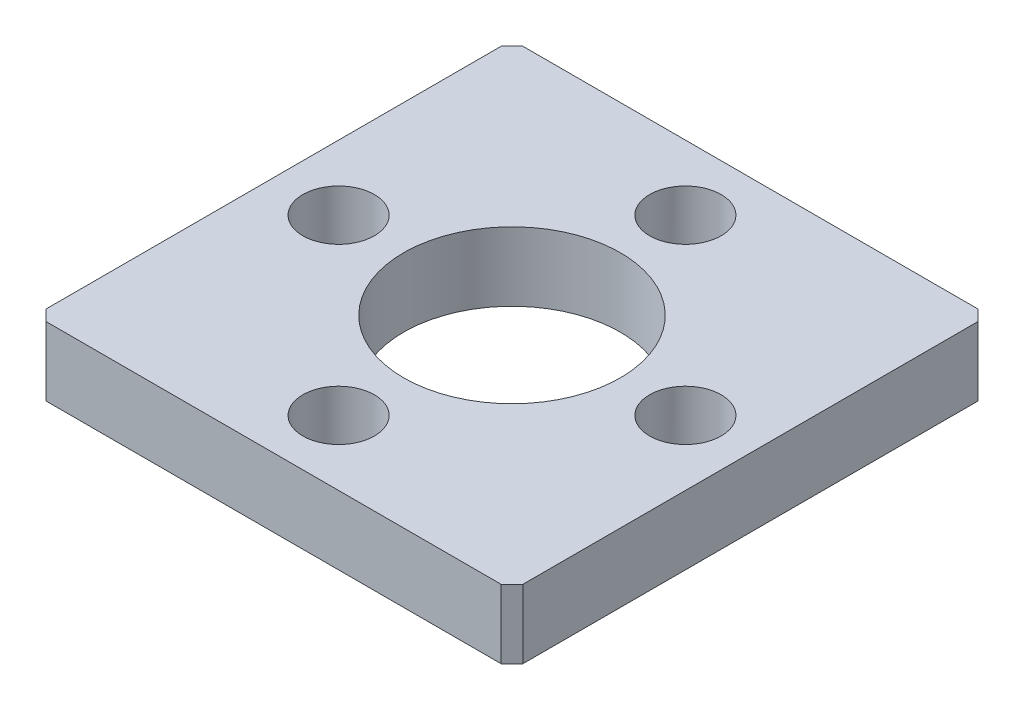
ISO-10303-21;
HEADER;
FILE_DESCRIPTION(('STEP AP214'),'2;1');
FILE_NAME('part.step','',(''),(''),'','','');
FILE_SCHEMA(('AUTOMOTIVE_DESIGN { 1 0 10303 214 1 1 1 1 }'));
ENDSEC;
DATA;
#1=APPLICATION_CONTEXT('core data for automotive mechanical design processes');
#2=APPLICATION_PROTOCOL_DEFINITION('international standard','automotive_design',2000,#1);
#3=PRODUCT_CONTEXT('',#1,'mechanical');
#4=PRODUCT('Part','Part','',(#3));
#5=PRODUCT_RELATED_PRODUCT_CATEGORY('part','',(#4));
#6=PRODUCT_DEFINITION_FORMATION('','',#4);
#7=PRODUCT_DEFINITION_CONTEXT('part definition',#1,'design');
#8=PRODUCT_DEFINITION('design','',#6,#7);
#9=PRODUCT_DEFINITION_SHAPE('','',#8);
#10=(LENGTH_UNIT() NAMED_UNIT(*) SI_UNIT(.MILLI.,.METRE.));
#11=(NAMED_UNIT(*) PLANE_ANGLE_UNIT() SI_UNIT($,.RADIAN.));
#12=(NAMED_UNIT(*) SI_UNIT($,.STERADIAN.) SOLID_ANGLE_UNIT());
#13=UNCERTAINTY_MEASURE_WITH_UNIT(LENGTH_MEASURE(1.E-05),#10,'distance_accuracy_value','');
#14=(GEOMETRIC_REPRESENTATION_CONTEXT(3) GLOBAL_UNCERTAINTY_ASSIGNED_CONTEXT((#13)) GLOBAL_UNIT_ASSIGNED_CONTEXT((#10,
#11,#12)) REPRESENTATION_CONTEXT('',''));
#15=CARTESIAN_POINT('',(0.,0.,0.));
#16=DIRECTION('',(0.,0.,1.));
#17=DIRECTION('',(1.,0.,0.));
#18=AXIS2_PLACEMENT_3D('',#15,#16,#17);
#19=CARTESIAN_POINT('',(11.,3.175,11.));
#20=DIRECTION('',(-1.,0.,0.));
#21=DIRECTION('',(0.,0.,1.));
#22=AXIS2_PLACEMENT_3D('',#19,#20,#21);
#23=PLANE('',#22);
#24=DIRECTION('',(0.,0.,-1.));
#25=VECTOR('',#24,1.);
#26=CARTESIAN_POINT('',(11.,0.,11.));
#27=LINE('',#26,#25);
#28=CARTESIAN_POINT('',(11.,0.,10.5));
#29=VERTEX_POINT('',#28);
#30=CARTESIAN_POINT('',(11.,0.,-10.5));
#31=VERTEX_POINT('',#30);
#32=EDGE_CURVE('E137',#29,#31,#27,.T.);
#33=ORIENTED_EDGE('',*,*,#32,.T.);
#34=DIRECTION('',(0.,1.,0.));
#35=VECTOR('',#34,1.);
#36=CARTESIAN_POINT('',(11.,3.175,-10.5));
#37=LINE('',#36,#35);
#38=CARTESIAN_POINT('',(11.,3.175,-10.5));
#39=VERTEX_POINT('',#38);
#40=EDGE_CURVE('E160',#31,#39,#37,.T.);
#41=ORIENTED_EDGE('',*,*,#40,.T.);
#42=DIRECTION('',(0.,0.,-1.));
#43=VECTOR('',#42,1.);
#44=CARTESIAN_POINT('',(11.,3.175,11.));
#45=LINE('',#44,#43);
#46=CARTESIAN_POINT('',(11.,3.175,10.5));
#47=VERTEX_POINT('',#46);
#48=EDGE_CURVE('E135',#47,#39,#45,.T.);
#49=ORIENTED_EDGE('',*,*,#48,.F.);
#50=DIRECTION('',(0.,-1.,0.));
#51=VECTOR('',#50,1.);
#52=CARTESIAN_POINT('',(11.,3.175,10.5));
#53=LINE('',#52,#51);
#54=EDGE_CURVE('E157',#47,#29,#53,.T.);
#55=ORIENTED_EDGE('',*,*,#54,.T.);
#56=EDGE_LOOP('',(#33,#41,#49,#55));
#57=FACE_BOUND('',#56,.T.);
#58=ADVANCED_FACE('F39',(#57),#23,.F.);
#59=CARTESIAN_POINT('',(-11.,3.175,-11.));
#60=DIRECTION('',(0.,0.,1.));
#61=DIRECTION('',(1.,0.,0.));
#62=AXIS2_PLACEMENT_3D('',#59,#60,#61);
#63=PLANE('',#62);
#64=DIRECTION('',(-1.,0.,0.));
#65=VECTOR('',#64,1.);
#66=CARTESIAN_POINT('',(-11.,0.,-11.));
#67=LINE('',#66,#65);
#68=CARTESIAN_POINT('',(10.5,0.,-11.));
#69=VERTEX_POINT('',#68);
#70=CARTESIAN_POINT('',(-10.5,0.,-11.));
#71=VERTEX_POINT('',#70);
#72=EDGE_CURVE('E133',#69,#71,#67,.T.);
#73=ORIENTED_EDGE('',*,*,#72,.T.);
#74=DIRECTION('',(0.,1.,0.));
#75=VECTOR('',#74,1.);
#76=CARTESIAN_POINT('',(-10.5,3.175,-11.));
#77=LINE('',#76,#75);
#78=CARTESIAN_POINT('',(-10.5,3.175,-11.));
#79=VERTEX_POINT('',#78);
#80=EDGE_CURVE('E112',#71,#79,#77,.T.);
#81=ORIENTED_EDGE('',*,*,#80,.T.);
#82=DIRECTION('',(-1.,0.,0.));
#83=VECTOR('',#82,1.);
#84=CARTESIAN_POINT('',(-11.,3.175,-11.));
#85=LINE('',#84,#83);
#86=CARTESIAN_POINT('',(10.5,3.175,-11.));
#87=VERTEX_POINT('',#86);
#88=EDGE_CURVE('E192',#87,#79,#85,.T.);
#89=ORIENTED_EDGE('',*,*,#88,.F.);
#90=DIRECTION('',(0.,-1.,0.));
#91=VECTOR('',#90,1.);
#92=CARTESIAN_POINT('',(10.5,3.175,-11.));
#93=LINE('',#92,#91);
#94=EDGE_CURVE('E117',#87,#69,#93,.T.);
#95=ORIENTED_EDGE('',*,*,#94,.T.);
#96=EDGE_LOOP('',(#73,#81,#89,#95));
#97=FACE_BOUND('',#96,.T.);
#98=ADVANCED_FACE('F209',(#97),#63,.F.);
#99=CARTESIAN_POINT('',(-11.,3.175,11.));
#100=DIRECTION('',(1.,0.,0.));
#101=DIRECTION('',(0.,0.,-1.));
#102=AXIS2_PLACEMENT_3D('',#99,#100,#101);
#103=PLANE('',#102);
#104=DIRECTION('',(0.,0.,1.));
#105=VECTOR('',#104,1.);
#106=CARTESIAN_POINT('',(-11.,3.175,11.));
#107=LINE('',#106,#105);
#108=CARTESIAN_POINT('',(-11.,3.175,-10.5));
#109=VERTEX_POINT('',#108);
#110=CARTESIAN_POINT('',(-11.,3.175,10.5));
#111=VERTEX_POINT('',#110);
#112=EDGE_CURVE('E126',#109,#111,#107,.T.);
#113=ORIENTED_EDGE('',*,*,#112,.F.);
#114=DIRECTION('',(0.,-1.,0.));
#115=VECTOR('',#114,1.);
#116=CARTESIAN_POINT('',(-11.,3.175,-10.5));
#117=LINE('',#116,#115);
#118=CARTESIAN_POINT('',(-11.,0.,-10.5));
#119=VERTEX_POINT('',#118);
#120=EDGE_CURVE('E111',#109,#119,#117,.T.);
#121=ORIENTED_EDGE('',*,*,#120,.T.);
#122=DIRECTION('',(0.,0.,1.));
#123=VECTOR('',#122,1.);
#124=CARTESIAN_POINT('',(-11.,0.,11.));
#125=LINE('',#124,#123);
#126=CARTESIAN_POINT('',(-11.,0.,10.5));
#127=VERTEX_POINT('',#126);
#128=EDGE_CURVE('E124',#119,#127,#125,.T.);
#129=ORIENTED_EDGE('',*,*,#128,.T.);
#130=DIRECTION('',(0.,1.,0.));
#131=VECTOR('',#130,1.);
#132=CARTESIAN_POINT('',(-11.,3.175,10.5));
#133=LINE('',#132,#131);
#134=EDGE_CURVE('E128',#127,#111,#133,.T.);
#135=ORIENTED_EDGE('',*,*,#134,.T.);
#136=EDGE_LOOP('',(#113,#121,#129,#135));
#137=FACE_BOUND('',#136,.T.);
#138=ADVANCED_FACE('F123',(#137),#103,.F.);
#139=CARTESIAN_POINT('',(-11.,3.175,11.));
#140=DIRECTION('',(0.,0.,-1.));
#141=DIRECTION('',(-1.,0.,0.));
#142=AXIS2_PLACEMENT_3D('',#139,#140,#141);
#143=PLANE('',#142);
#144=DIRECTION('',(1.,0.,0.));
#145=VECTOR('',#144,1.);
#146=CARTESIAN_POINT('',(-11.,0.,11.));
#147=LINE('',#146,#145);
#148=CARTESIAN_POINT('',(-10.5,0.,11.));
#149=VERTEX_POINT('',#148);
#150=CARTESIAN_POINT('',(10.5,0.,11.));
#151=VERTEX_POINT('',#150);
#152=EDGE_CURVE('E132',#149,#151,#147,.T.);
#153=ORIENTED_EDGE('',*,*,#152,.T.);
#154=DIRECTION('',(0.,1.,0.));
#155=VECTOR('',#154,1.);
#156=CARTESIAN_POINT('',(10.5,3.175,11.));
#157=LINE('',#156,#155);
#158=CARTESIAN_POINT('',(10.5,3.175,11.));
#159=VERTEX_POINT('',#158);
#160=EDGE_CURVE('E11',#151,#159,#157,.T.);
#161=ORIENTED_EDGE('',*,*,#160,.T.);
#162=DIRECTION('',(1.,0.,0.));
#163=VECTOR('',#162,1.);
#164=CARTESIAN_POINT('',(-11.,3.175,11.));
#165=LINE('',#164,#163);
#166=CARTESIAN_POINT('',(-10.5,3.175,11.));
#167=VERTEX_POINT('',#166);
#168=EDGE_CURVE('E141',#167,#159,#165,.T.);
#169=ORIENTED_EDGE('',*,*,#168,.F.);
#170=DIRECTION('',(0.,-1.,0.));
#171=VECTOR('',#170,1.);
#172=CARTESIAN_POINT('',(-10.5,3.175,11.));
#173=LINE('',#172,#171);
#174=EDGE_CURVE('E49',#167,#149,#173,.T.);
#175=ORIENTED_EDGE('',*,*,#174,.T.);
#176=EDGE_LOOP('',(#153,#161,#169,#175));
#177=FACE_BOUND('',#176,.T.);
#178=ADVANCED_FACE('F216',(#177),#143,.F.);
#179=CARTESIAN_POINT('',(0.,3.175,0.));
#180=DIRECTION('',(0.,-1.,0.));
#181=DIRECTION('',(0.,0.,-1.));
#182=AXIS2_PLACEMENT_3D('',#179,#180,#181);
#183=PLANE('',#182);
#184=CARTESIAN_POINT('',(8.,3.175,0.));
#185=DIRECTION('',(0.,1.,0.));
#186=DIRECTION('',(0.,0.,1.));
#187=AXIS2_PLACEMENT_3D('',#184,#185,#186);
#188=CIRCLE('',#187,1.64999999999999);
#189=CARTESIAN_POINT('',(8.,3.175,1.64999999999998));
#190=VERTEX_POINT('',#189);
#191=EDGE_CURVE('E277',#190,#190,#188,.T.);
#192=ORIENTED_EDGE('',*,*,#191,.F.);
#193=EDGE_LOOP('',(#192));
#194=FACE_BOUND('',#193,.T.);
#195=CARTESIAN_POINT('',(0.,3.175,7.99999999999999));
#196=DIRECTION('',(0.,1.,0.));
#197=DIRECTION('',(0.,0.,1.));
#198=AXIS2_PLACEMENT_3D('',#195,#196,#197);
#199=CIRCLE('',#198,1.64999999999999);
#200=CARTESIAN_POINT('',(0.,3.175,9.64999999999998));
#201=VERTEX_POINT('',#200);
#202=EDGE_CURVE('E178',#201,#201,#199,.T.);
#203=ORIENTED_EDGE('',*,*,#202,.F.);
#204=EDGE_LOOP('',(#203));
#205=FACE_BOUND('',#204,.T.);
#206=CARTESIAN_POINT('',(-8.,3.175,0.));
#207=DIRECTION('',(0.,1.,0.));
#208=DIRECTION('',(0.,0.,1.));
#209=AXIS2_PLACEMENT_3D('',#206,#207,#208);
#210=CIRCLE('',#209,1.64999999999999);
#211=CARTESIAN_POINT('',(-8.,3.175,1.64999999999993));
#212=VERTEX_POINT('',#211);
#213=EDGE_CURVE('E166',#212,#212,#210,.T.);
#214=ORIENTED_EDGE('',*,*,#213,.F.);
#215=EDGE_LOOP('',(#214));
#216=FACE_BOUND('',#215,.T.);
#217=CARTESIAN_POINT('',(0.,3.175,-8.00000000000001));
#218=DIRECTION('',(0.,1.,0.));
#219=DIRECTION('',(0.,0.,1.));
#220=AXIS2_PLACEMENT_3D('',#217,#218,#219);
#221=CIRCLE('',#220,1.64999999999999);
#222=CARTESIAN_POINT('',(0.,3.175,-6.35000000000002));
#223=VERTEX_POINT('',#222);
#224=EDGE_CURVE('E165',#223,#223,#221,.T.);
#225=ORIENTED_EDGE('',*,*,#224,.F.);
#226=EDGE_LOOP('',(#225));
#227=FACE_BOUND('',#226,.T.);
#228=CARTESIAN_POINT('',(0.,3.175,0.));
#229=DIRECTION('',(0.,1.,0.));
#230=DIRECTION('',(0.,0.,1.));
#231=AXIS2_PLACEMENT_3D('',#228,#229,#230);
#232=CIRCLE('',#231,5.);
#233=CARTESIAN_POINT('',(0.,3.175,5.));
#234=VERTEX_POINT('',#233);
#235=EDGE_CURVE('E184',#234,#234,#232,.T.);
#236=ORIENTED_EDGE('',*,*,#235,.F.);
#237=EDGE_LOOP('',(#236));
#238=FACE_BOUND('',#237,.T.);
#239=ORIENTED_EDGE('',*,*,#88,.T.);
#240=DIRECTION('',(0.707106781186548,0.,-0.707106781186548));
#241=VECTOR('',#240,1.);
#242=CARTESIAN_POINT('',(-11.,3.175,-10.5));
#243=LINE('',#242,#241);
#244=EDGE_CURVE('E155',#79,#109,#243,.F.);
#245=ORIENTED_EDGE('',*,*,#244,.T.);
#246=ORIENTED_EDGE('',*,*,#112,.T.);
#247=DIRECTION('',(-0.707106781186548,0.,-0.707106781186548));
#248=VECTOR('',#247,1.);
#249=CARTESIAN_POINT('',(-10.5,3.175,11.));
#250=LINE('',#249,#248);
#251=EDGE_CURVE('E62',#111,#167,#250,.F.);
#252=ORIENTED_EDGE('',*,*,#251,.T.);
#253=ORIENTED_EDGE('',*,*,#168,.T.);
#254=DIRECTION('',(-0.707106781186548,0.,0.707106781186548));
#255=VECTOR('',#254,1.);
#256=CARTESIAN_POINT('',(11.,3.175,10.5));
#257=LINE('',#256,#255);
#258=EDGE_CURVE('E151',#159,#47,#257,.F.);
#259=ORIENTED_EDGE('',*,*,#258,.T.);
#260=ORIENTED_EDGE('',*,*,#48,.T.);
#261=DIRECTION('',(0.707106781186548,0.,0.707106781186548));
#262=VECTOR('',#261,1.);
#263=CARTESIAN_POINT('',(10.5,3.175,-11.));
#264=LINE('',#263,#262);
#265=EDGE_CURVE('E153',#39,#87,#264,.F.);
#266=ORIENTED_EDGE('',*,*,#265,.T.);
#267=EDGE_LOOP('',(#239,#245,#246,#252,#253,#259,#260,#266));
#268=FACE_BOUND('',#267,.T.);
#269=ADVANCED_FACE('F207',(#194,#205,#216,#227,#238,#268),#183,.F.);
#270=CARTESIAN_POINT('',(0.,0.,0.));
#271=DIRECTION('',(0.,-1.,0.));
#272=DIRECTION('',(0.,0.,-1.));
#273=AXIS2_PLACEMENT_3D('',#270,#271,#272);
#274=PLANE('',#273);
#275=CARTESIAN_POINT('',(8.,0.,0.));
#276=DIRECTION('',(0.,-1.,0.));
#277=DIRECTION('',(0.,0.,-1.));
#278=AXIS2_PLACEMENT_3D('',#275,#276,#277);
#279=CIRCLE('',#278,1.64999999999999);
#280=CARTESIAN_POINT('',(8.,0.,-1.65));
#281=VERTEX_POINT('',#280);
#282=EDGE_CURVE('E44',#281,#281,#279,.T.);
#283=ORIENTED_EDGE('',*,*,#282,.F.);
#284=EDGE_LOOP('',(#283));
#285=FACE_BOUND('',#284,.T.);
#286=CARTESIAN_POINT('',(0.,0.,7.99999999999999));
#287=DIRECTION('',(0.,-1.,0.));
#288=DIRECTION('',(0.,0.,-1.));
#289=AXIS2_PLACEMENT_3D('',#286,#287,#288);
#290=CIRCLE('',#289,1.64999999999999);
#291=CARTESIAN_POINT('',(0.,0.,6.35000000000001));
#292=VERTEX_POINT('',#291);
#293=EDGE_CURVE('E173',#292,#292,#290,.T.);
#294=ORIENTED_EDGE('',*,*,#293,.F.);
#295=EDGE_LOOP('',(#294));
#296=FACE_BOUND('',#295,.T.);
#297=CARTESIAN_POINT('',(-8.,0.,0.));
#298=DIRECTION('',(0.,-1.,0.));
#299=DIRECTION('',(0.,0.,-1.));
#300=AXIS2_PLACEMENT_3D('',#297,#298,#299);
#301=CIRCLE('',#300,1.64999999999999);
#302=CARTESIAN_POINT('',(-8.,0.,-1.65000000000005));
#303=VERTEX_POINT('',#302);
#304=EDGE_CURVE('E163',#303,#303,#301,.T.);
#305=ORIENTED_EDGE('',*,*,#304,.F.);
#306=EDGE_LOOP('',(#305));
#307=FACE_BOUND('',#306,.T.);
#308=CARTESIAN_POINT('',(0.,0.,-8.00000000000001));
#309=DIRECTION('',(0.,-1.,0.));
#310=DIRECTION('',(0.,0.,-1.));
#311=AXIS2_PLACEMENT_3D('',#308,#309,#310);
#312=CIRCLE('',#311,1.64999999999999);
#313=CARTESIAN_POINT('',(0.,0.,-9.65));
#314=VERTEX_POINT('',#313);
#315=EDGE_CURVE('E170',#314,#314,#312,.T.);
#316=ORIENTED_EDGE('',*,*,#315,.F.);
#317=EDGE_LOOP('',(#316));
#318=FACE_BOUND('',#317,.T.);
#319=CARTESIAN_POINT('',(0.,0.,0.));
#320=DIRECTION('',(0.,1.,0.));
#321=DIRECTION('',(0.,0.,1.));
#322=AXIS2_PLACEMENT_3D('',#319,#320,#321);
#323=CIRCLE('',#322,5.);
#324=CARTESIAN_POINT('',(0.,0.,5.));
#325=VERTEX_POINT('',#324);
#326=EDGE_CURVE('E185',#325,#325,#323,.T.);
#327=ORIENTED_EDGE('',*,*,#326,.T.);
#328=EDGE_LOOP('',(#327));
#329=FACE_BOUND('',#328,.T.);
#330=ORIENTED_EDGE('',*,*,#128,.F.);
#331=DIRECTION('',(-0.707106781186548,0.,0.707106781186548));
#332=VECTOR('',#331,1.);
#333=CARTESIAN_POINT('',(-10.75,0.,-10.75));
#334=LINE('',#333,#332);
#335=EDGE_CURVE('E107',#119,#71,#334,.F.);
#336=ORIENTED_EDGE('',*,*,#335,.T.);
#337=ORIENTED_EDGE('',*,*,#72,.F.);
#338=DIRECTION('',(-0.707106781186548,0.,-0.707106781186548));
#339=VECTOR('',#338,1.);
#340=CARTESIAN_POINT('',(10.75,0.,-10.75));
#341=LINE('',#340,#339);
#342=EDGE_CURVE('E118',#69,#31,#341,.F.);
#343=ORIENTED_EDGE('',*,*,#342,.T.);
#344=ORIENTED_EDGE('',*,*,#32,.F.);
#345=DIRECTION('',(0.707106781186548,0.,-0.707106781186548));
#346=VECTOR('',#345,1.);
#347=CARTESIAN_POINT('',(10.75,0.,10.75));
#348=LINE('',#347,#346);
#349=EDGE_CURVE('E144',#29,#151,#348,.F.);
#350=ORIENTED_EDGE('',*,*,#349,.T.);
#351=ORIENTED_EDGE('',*,*,#152,.F.);
#352=DIRECTION('',(0.707106781186548,0.,0.707106781186548));
#353=VECTOR('',#352,1.);
#354=CARTESIAN_POINT('',(-10.75,0.,10.75));
#355=LINE('',#354,#353);
#356=EDGE_CURVE('E127',#149,#127,#355,.F.);
#357=ORIENTED_EDGE('',*,*,#356,.T.);
#358=EDGE_LOOP('',(#330,#336,#337,#343,#344,#350,#351,#357));
#359=FACE_BOUND('',#358,.T.);
#360=ADVANCED_FACE('F130',(#285,#296,#307,#318,#329,#359),#274,.T.);
#361=CARTESIAN_POINT('',(0.,0.,0.));
#362=DIRECTION('',(0.,1.,0.));
#363=DIRECTION('',(0.,0.,1.));
#364=AXIS2_PLACEMENT_3D('',#361,#362,#363);
#365=CYLINDRICAL_SURFACE('',#364,5.);
#366=ORIENTED_EDGE('',*,*,#326,.F.);
#367=EDGE_LOOP('',(#366));
#368=FACE_BOUND('',#367,.T.);
#369=ORIENTED_EDGE('',*,*,#235,.T.);
#370=EDGE_LOOP('',(#369));
#371=FACE_BOUND('',#370,.T.);
#372=ADVANCED_FACE('F227',(#368,#371),#365,.F.);
#373=CARTESIAN_POINT('',(-11.,3.175,-10.5));
#374=DIRECTION('',(0.707106781186547,0.,0.707106781186547));
#375=DIRECTION('',(0.,-1.,0.));
#376=AXIS2_PLACEMENT_3D('',#373,#374,#375);
#377=PLANE('',#376);
#378=ORIENTED_EDGE('',*,*,#244,.F.);
#379=ORIENTED_EDGE('',*,*,#80,.F.);
#380=ORIENTED_EDGE('',*,*,#335,.F.);
#381=ORIENTED_EDGE('',*,*,#120,.F.);
#382=EDGE_LOOP('',(#378,#379,#380,#381));
#383=FACE_BOUND('',#382,.T.);
#384=ADVANCED_FACE('F110',(#383),#377,.F.);
#385=CARTESIAN_POINT('',(10.5,3.175,-11.));
#386=DIRECTION('',(-0.707106781186547,0.,0.707106781186547));
#387=DIRECTION('',(0.,-1.,0.));
#388=AXIS2_PLACEMENT_3D('',#385,#386,#387);
#389=PLANE('',#388);
#390=ORIENTED_EDGE('',*,*,#265,.F.);
#391=ORIENTED_EDGE('',*,*,#40,.F.);
#392=ORIENTED_EDGE('',*,*,#342,.F.);
#393=ORIENTED_EDGE('',*,*,#94,.F.);
#394=EDGE_LOOP('',(#390,#391,#392,#393));
#395=FACE_BOUND('',#394,.T.);
#396=ADVANCED_FACE('F204',(#395),#389,.F.);
#397=CARTESIAN_POINT('',(11.,3.175,10.5));
#398=DIRECTION('',(-0.707106781186547,0.,-0.707106781186547));
#399=DIRECTION('',(0.,-1.,0.));
#400=AXIS2_PLACEMENT_3D('',#397,#398,#399);
#401=PLANE('',#400);
#402=ORIENTED_EDGE('',*,*,#258,.F.);
#403=ORIENTED_EDGE('',*,*,#160,.F.);
#404=ORIENTED_EDGE('',*,*,#349,.F.);
#405=ORIENTED_EDGE('',*,*,#54,.F.);
#406=EDGE_LOOP('',(#402,#403,#404,#405));
#407=FACE_BOUND('',#406,.T.);
#408=ADVANCED_FACE('F232',(#407),#401,.F.);
#409=CARTESIAN_POINT('',(-10.5,3.175,11.));
#410=DIRECTION('',(0.707106781186547,0.,-0.707106781186547));
#411=DIRECTION('',(0.,-1.,0.));
#412=AXIS2_PLACEMENT_3D('',#409,#410,#411);
#413=PLANE('',#412);
#414=ORIENTED_EDGE('',*,*,#251,.F.);
#415=ORIENTED_EDGE('',*,*,#134,.F.);
#416=ORIENTED_EDGE('',*,*,#356,.F.);
#417=ORIENTED_EDGE('',*,*,#174,.F.);
#418=EDGE_LOOP('',(#414,#415,#416,#417));
#419=FACE_BOUND('',#418,.T.);
#420=ADVANCED_FACE('F42',(#419),#413,.F.);
#421=CARTESIAN_POINT('',(0.,3.175,-8.00000000000001));
#422=DIRECTION('',(0.,1.,0.));
#423=DIRECTION('',(0.,0.,1.));
#424=AXIS2_PLACEMENT_3D('',#421,#422,#423);
#425=CYLINDRICAL_SURFACE('',#424,1.64999999999999);
#426=ORIENTED_EDGE('',*,*,#315,.T.);
#427=EDGE_LOOP('',(#426));
#428=FACE_BOUND('',#427,.T.);
#429=ORIENTED_EDGE('',*,*,#224,.T.);
#430=EDGE_LOOP('',(#429));
#431=FACE_BOUND('',#430,.T.);
#432=ADVANCED_FACE('F240',(#428,#431),#425,.F.);
#433=CARTESIAN_POINT('',(-8.,3.175,0.));
#434=DIRECTION('',(0.,1.,0.));
#435=DIRECTION('',(0.,0.,1.));
#436=AXIS2_PLACEMENT_3D('',#433,#434,#435);
#437=CYLINDRICAL_SURFACE('',#436,1.64999999999999);
#438=ORIENTED_EDGE('',*,*,#304,.T.);
#439=EDGE_LOOP('',(#438));
#440=FACE_BOUND('',#439,.T.);
#441=ORIENTED_EDGE('',*,*,#213,.T.);
#442=EDGE_LOOP('',(#441));
#443=FACE_BOUND('',#442,.T.);
#444=ADVANCED_FACE('F259',(#440,#443),#437,.F.);
#445=CARTESIAN_POINT('',(0.,3.175,7.99999999999999));
#446=DIRECTION('',(0.,1.,0.));
#447=DIRECTION('',(0.,0.,1.));
#448=AXIS2_PLACEMENT_3D('',#445,#446,#447);
#449=CYLINDRICAL_SURFACE('',#448,1.64999999999999);
#450=ORIENTED_EDGE('',*,*,#293,.T.);
#451=EDGE_LOOP('',(#450));
#452=FACE_BOUND('',#451,.T.);
#453=ORIENTED_EDGE('',*,*,#202,.T.);
#454=EDGE_LOOP('',(#453));
#455=FACE_BOUND('',#454,.T.);
#456=ADVANCED_FACE('F263',(#452,#455),#449,.F.);
#457=CARTESIAN_POINT('',(8.,3.175,0.));
#458=DIRECTION('',(0.,1.,0.));
#459=DIRECTION('',(0.,0.,1.));
#460=AXIS2_PLACEMENT_3D('',#457,#458,#459);
#461=CYLINDRICAL_SURFACE('',#460,1.64999999999999);
#462=ORIENTED_EDGE('',*,*,#282,.T.);
#463=EDGE_LOOP('',(#462));
#464=FACE_BOUND('',#463,.T.);
#465=ORIENTED_EDGE('',*,*,#191,.T.);
#466=EDGE_LOOP('',(#465));
#467=FACE_BOUND('',#466,.T.);
#468=ADVANCED_FACE('F266',(#464,#467),#461,.F.);
#469=CLOSED_SHELL('',(#58,#98,#138,#178,#269,#360,#372,#384,#396,#408,#420,#432,#444,#456,#468));
#470=MANIFOLD_SOLID_BREP('B2',#469);
#471=ADVANCED_BREP_SHAPE_REPRESENTATION('',(#18,#470),#14);
#472=SHAPE_DEFINITION_REPRESENTATION(#9,#471);
ENDSEC;
END-ISO-10303-21;
